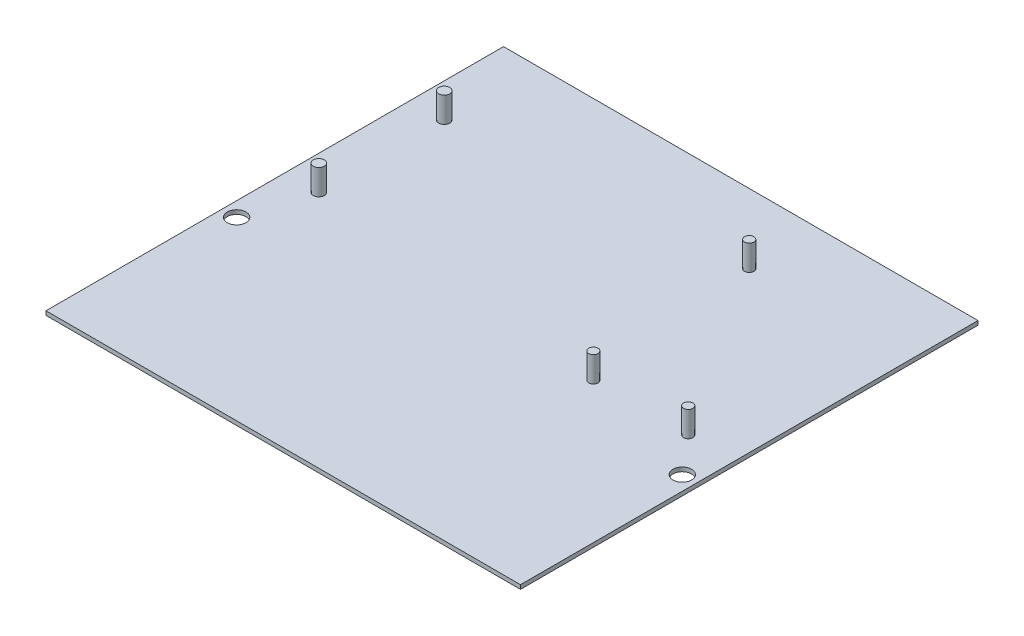
ISO-10303-21;
HEADER;
FILE_DESCRIPTION(('STEP AP214'),'2;1');
FILE_NAME('part.step','',(''),(''),'','','');
FILE_SCHEMA(('AUTOMOTIVE_DESIGN { 1 0 10303 214 1 1 1 1 }'));
ENDSEC;
DATA;
#1=APPLICATION_CONTEXT('core data for automotive mechanical design processes');
#2=APPLICATION_PROTOCOL_DEFINITION('international standard','automotive_design',2000,#1);
#3=PRODUCT_CONTEXT('',#1,'mechanical');
#4=PRODUCT('Part','Part','',(#3));
#5=PRODUCT_RELATED_PRODUCT_CATEGORY('part','',(#4));
#6=PRODUCT_DEFINITION_FORMATION('','',#4);
#7=PRODUCT_DEFINITION_CONTEXT('part definition',#1,'design');
#8=PRODUCT_DEFINITION('design','',#6,#7);
#9=PRODUCT_DEFINITION_SHAPE('','',#8);
#10=(LENGTH_UNIT() NAMED_UNIT(*) SI_UNIT(.MILLI.,.METRE.));
#11=(NAMED_UNIT(*) PLANE_ANGLE_UNIT() SI_UNIT($,.RADIAN.));
#12=(NAMED_UNIT(*) SI_UNIT($,.STERADIAN.) SOLID_ANGLE_UNIT());
#13=UNCERTAINTY_MEASURE_WITH_UNIT(LENGTH_MEASURE(1.E-05),#10,'distance_accuracy_value','');
#14=(GEOMETRIC_REPRESENTATION_CONTEXT(3) GLOBAL_UNCERTAINTY_ASSIGNED_CONTEXT((#13)) GLOBAL_UNIT_ASSIGNED_CONTEXT((#10,
#11,#12)) REPRESENTATION_CONTEXT('',''));
#15=CARTESIAN_POINT('',(0.,0.,0.));
#16=DIRECTION('',(0.,0.,1.));
#17=DIRECTION('',(1.,0.,0.));
#18=AXIS2_PLACEMENT_3D('',#15,#16,#17);
#19=CARTESIAN_POINT('',(0.,1.2,0.));
#20=DIRECTION('',(0.,1.,0.));
#21=DIRECTION('',(0.,0.,1.));
#22=AXIS2_PLACEMENT_3D('',#19,#20,#21);
#23=PLANE('',#22);
#24=CARTESIAN_POINT('',(28.5,1.2,4.49999999999998));
#25=DIRECTION('',(0.,1.,0.));
#26=DIRECTION('',(0.,0.,1.));
#27=AXIS2_PLACEMENT_3D('',#24,#25,#26);
#28=CIRCLE('',#27,1.375);
#29=CARTESIAN_POINT('',(28.5,1.2,5.87499999999998));
#30=VERTEX_POINT('',#29);
#31=EDGE_CURVE('E142',#30,#30,#28,.T.);
#32=ORIENTED_EDGE('',*,*,#31,.F.);
#33=EDGE_LOOP('',(#32));
#34=FACE_BOUND('',#33,.T.);
#35=CARTESIAN_POINT('',(-60.,1.2,-3.00000000000004));
#36=DIRECTION('',(0.,1.,0.));
#37=DIRECTION('',(0.,0.,1.));
#38=AXIS2_PLACEMENT_3D('',#35,#36,#37);
#39=CIRCLE('',#38,1.625);
#40=CARTESIAN_POINT('',(-60.,1.2,-1.37500000000003));
#41=VERTEX_POINT('',#40);
#42=EDGE_CURVE('E130',#41,#41,#39,.T.);
#43=ORIENTED_EDGE('',*,*,#42,.F.);
#44=EDGE_LOOP('',(#43));
#45=FACE_BOUND('',#44,.T.);
#46=CARTESIAN_POINT('',(-65.75,1.2,15.5));
#47=DIRECTION('',(0.,-1.,0.));
#48=DIRECTION('',(0.,0.,1.));
#49=AXIS2_PLACEMENT_3D('',#46,#47,#48);
#50=CIRCLE('',#49,2.75000000000001);
#51=CARTESIAN_POINT('',(-65.75,1.2,18.25));
#52=VERTEX_POINT('',#51);
#53=EDGE_CURVE('E117',#52,#52,#50,.T.);
#54=ORIENTED_EDGE('',*,*,#53,.T.);
#55=EDGE_LOOP('',(#54));
#56=FACE_BOUND('',#55,.T.);
#57=CARTESIAN_POINT('',(65.75,1.2,15.5));
#58=DIRECTION('',(0.,1.,0.));
#59=DIRECTION('',(0.,0.,1.));
#60=AXIS2_PLACEMENT_3D('',#57,#58,#59);
#61=CIRCLE('',#60,2.75000000000001);
#62=CARTESIAN_POINT('',(65.75,1.2,18.25));
#63=VERTEX_POINT('',#62);
#64=EDGE_CURVE('E114',#63,#63,#61,.T.);
#65=ORIENTED_EDGE('',*,*,#64,.F.);
#66=EDGE_LOOP('',(#65));
#67=FACE_BOUND('',#66,.T.);
#68=DIRECTION('',(0.,0.,-1.));
#69=VECTOR('',#68,1.);
#70=CARTESIAN_POINT('',(70.,1.2,-67.5));
#71=LINE('',#70,#69);
#72=CARTESIAN_POINT('',(70.,1.2,67.5));
#73=VERTEX_POINT('',#72);
#74=CARTESIAN_POINT('',(70.,1.2,-67.5));
#75=VERTEX_POINT('',#74);
#76=EDGE_CURVE('E85',#73,#75,#71,.T.);
#77=ORIENTED_EDGE('',*,*,#76,.T.);
#78=DIRECTION('',(-1.,0.,0.));
#79=VECTOR('',#78,1.);
#80=CARTESIAN_POINT('',(-70.,1.2,-67.5));
#81=LINE('',#80,#79);
#82=CARTESIAN_POINT('',(-70.,1.2,-67.5));
#83=VERTEX_POINT('',#82);
#84=EDGE_CURVE('E80',#75,#83,#81,.T.);
#85=ORIENTED_EDGE('',*,*,#84,.T.);
#86=DIRECTION('',(0.,0.,1.));
#87=VECTOR('',#86,1.);
#88=CARTESIAN_POINT('',(-70.,1.2,-67.5));
#89=LINE('',#88,#87);
#90=CARTESIAN_POINT('',(-70.,1.2,67.5));
#91=VERTEX_POINT('',#90);
#92=EDGE_CURVE('E83',#83,#91,#89,.T.);
#93=ORIENTED_EDGE('',*,*,#92,.T.);
#94=DIRECTION('',(1.,0.,0.));
#95=VECTOR('',#94,1.);
#96=CARTESIAN_POINT('',(-70.,1.2,67.5));
#97=LINE('',#96,#95);
#98=EDGE_CURVE('E50',#91,#73,#97,.T.);
#99=ORIENTED_EDGE('',*,*,#98,.T.);
#100=EDGE_LOOP('',(#77,#85,#93,#99));
#101=FACE_BOUND('',#100,.T.);
#102=CARTESIAN_POINT('',(-60.,1.2,-40.));
#103=DIRECTION('',(0.,1.,0.));
#104=DIRECTION('',(0.,0.,1.));
#105=AXIS2_PLACEMENT_3D('',#102,#103,#104);
#106=CIRCLE('',#105,1.625);
#107=CARTESIAN_POINT('',(-60.,1.2,-38.375));
#108=VERTEX_POINT('',#107);
#109=EDGE_CURVE('E124',#108,#108,#106,.T.);
#110=ORIENTED_EDGE('',*,*,#109,.F.);
#111=EDGE_LOOP('',(#110));
#112=FACE_BOUND('',#111,.T.);
#113=CARTESIAN_POINT('',(56.5,1.2,4.49999999999998));
#114=DIRECTION('',(0.,1.,0.));
#115=DIRECTION('',(0.,0.,1.));
#116=AXIS2_PLACEMENT_3D('',#113,#114,#115);
#117=CIRCLE('',#116,1.375);
#118=CARTESIAN_POINT('',(56.5,1.2,5.87499999999998));
#119=VERTEX_POINT('',#118);
#120=EDGE_CURVE('E136',#119,#119,#117,.T.);
#121=ORIENTED_EDGE('',*,*,#120,.F.);
#122=EDGE_LOOP('',(#121));
#123=FACE_BOUND('',#122,.T.);
#124=CARTESIAN_POINT('',(23.,1.2,-47.));
#125=DIRECTION('',(0.,1.,0.));
#126=DIRECTION('',(0.,0.,1.));
#127=AXIS2_PLACEMENT_3D('',#124,#125,#126);
#128=CIRCLE('',#127,1.375);
#129=CARTESIAN_POINT('',(23.,1.2,-45.625));
#130=VERTEX_POINT('',#129);
#131=EDGE_CURVE('E148',#130,#130,#128,.T.);
#132=ORIENTED_EDGE('',*,*,#131,.F.);
#133=EDGE_LOOP('',(#132));
#134=FACE_BOUND('',#133,.T.);
#135=ADVANCED_FACE('F33',(#34,#45,#56,#67,#101,#112,#123,#134),#23,.T.);
#136=CARTESIAN_POINT('',(0.,0.,0.));
#137=DIRECTION('',(0.,1.,0.));
#138=DIRECTION('',(0.,0.,1.));
#139=AXIS2_PLACEMENT_3D('',#136,#137,#138);
#140=PLANE('',#139);
#141=DIRECTION('',(0.,0.,-1.));
#142=VECTOR('',#141,1.);
#143=CARTESIAN_POINT('',(70.,0.,-67.5));
#144=LINE('',#143,#142);
#145=CARTESIAN_POINT('',(70.,0.,67.5));
#146=VERTEX_POINT('',#145);
#147=CARTESIAN_POINT('',(70.,0.,-67.5));
#148=VERTEX_POINT('',#147);
#149=EDGE_CURVE('E97',#146,#148,#144,.T.);
#150=ORIENTED_EDGE('',*,*,#149,.F.);
#151=DIRECTION('',(1.,0.,0.));
#152=VECTOR('',#151,1.);
#153=CARTESIAN_POINT('',(-70.,0.,67.5));
#154=LINE('',#153,#152);
#155=CARTESIAN_POINT('',(-70.,0.,67.5));
#156=VERTEX_POINT('',#155);
#157=EDGE_CURVE('E73',#156,#146,#154,.T.);
#158=ORIENTED_EDGE('',*,*,#157,.F.);
#159=DIRECTION('',(0.,0.,1.));
#160=VECTOR('',#159,1.);
#161=CARTESIAN_POINT('',(-70.,0.,-67.5));
#162=LINE('',#161,#160);
#163=CARTESIAN_POINT('',(-70.,0.,-67.5));
#164=VERTEX_POINT('',#163);
#165=EDGE_CURVE('E67',#164,#156,#162,.T.);
#166=ORIENTED_EDGE('',*,*,#165,.F.);
#167=DIRECTION('',(-1.,0.,0.));
#168=VECTOR('',#167,1.);
#169=CARTESIAN_POINT('',(-70.,0.,-67.5));
#170=LINE('',#169,#168);
#171=EDGE_CURVE('E89',#148,#164,#170,.T.);
#172=ORIENTED_EDGE('',*,*,#171,.F.);
#173=EDGE_LOOP('',(#150,#158,#166,#172));
#174=FACE_BOUND('',#173,.T.);
#175=CARTESIAN_POINT('',(65.75,0.,15.5));
#176=DIRECTION('',(0.,1.,0.));
#177=DIRECTION('',(0.,0.,1.));
#178=AXIS2_PLACEMENT_3D('',#175,#176,#177);
#179=CIRCLE('',#178,2.75000000000001);
#180=CARTESIAN_POINT('',(65.75,0.,18.25));
#181=VERTEX_POINT('',#180);
#182=EDGE_CURVE('E100',#181,#181,#179,.F.);
#183=ORIENTED_EDGE('',*,*,#182,.F.);
#184=EDGE_LOOP('',(#183));
#185=FACE_BOUND('',#184,.T.);
#186=CARTESIAN_POINT('',(-65.75,0.,15.5));
#187=DIRECTION('',(0.,1.,0.));
#188=DIRECTION('',(0.,0.,1.));
#189=AXIS2_PLACEMENT_3D('',#186,#187,#188);
#190=CIRCLE('',#189,2.75000000000001);
#191=CARTESIAN_POINT('',(-65.75,0.,18.25));
#192=VERTEX_POINT('',#191);
#193=EDGE_CURVE('E118',#192,#192,#190,.T.);
#194=ORIENTED_EDGE('',*,*,#193,.T.);
#195=EDGE_LOOP('',(#194));
#196=FACE_BOUND('',#195,.T.);
#197=ADVANCED_FACE('F108',(#174,#185,#196),#140,.F.);
#198=CARTESIAN_POINT('',(70.,1.2,-67.5));
#199=DIRECTION('',(-1.,0.,0.));
#200=DIRECTION('',(0.,0.,1.));
#201=AXIS2_PLACEMENT_3D('',#198,#199,#200);
#202=PLANE('',#201);
#203=ORIENTED_EDGE('',*,*,#149,.T.);
#204=DIRECTION('',(0.,-1.,0.));
#205=VECTOR('',#204,1.);
#206=CARTESIAN_POINT('',(70.,1.2,-67.5));
#207=LINE('',#206,#205);
#208=EDGE_CURVE('E11',#75,#148,#207,.T.);
#209=ORIENTED_EDGE('',*,*,#208,.F.);
#210=ORIENTED_EDGE('',*,*,#76,.F.);
#211=DIRECTION('',(0.,-1.,0.));
#212=VECTOR('',#211,1.);
#213=CARTESIAN_POINT('',(70.,1.2,67.5));
#214=LINE('',#213,#212);
#215=EDGE_CURVE('E93',#73,#146,#214,.T.);
#216=ORIENTED_EDGE('',*,*,#215,.T.);
#217=EDGE_LOOP('',(#203,#209,#210,#216));
#218=FACE_BOUND('',#217,.T.);
#219=ADVANCED_FACE('F35',(#218),#202,.F.);
#220=CARTESIAN_POINT('',(-70.,1.2,-67.5));
#221=DIRECTION('',(0.,0.,1.));
#222=DIRECTION('',(1.,0.,0.));
#223=AXIS2_PLACEMENT_3D('',#220,#221,#222);
#224=PLANE('',#223);
#225=ORIENTED_EDGE('',*,*,#171,.T.);
#226=DIRECTION('',(0.,-1.,0.));
#227=VECTOR('',#226,1.);
#228=CARTESIAN_POINT('',(-70.,1.2,-67.5));
#229=LINE('',#228,#227);
#230=EDGE_CURVE('E42',#83,#164,#229,.T.);
#231=ORIENTED_EDGE('',*,*,#230,.F.);
#232=ORIENTED_EDGE('',*,*,#84,.F.);
#233=ORIENTED_EDGE('',*,*,#208,.T.);
#234=EDGE_LOOP('',(#225,#231,#232,#233));
#235=FACE_BOUND('',#234,.T.);
#236=ADVANCED_FACE('F88',(#235),#224,.F.);
#237=CARTESIAN_POINT('',(-70.,1.2,-67.5));
#238=DIRECTION('',(1.,0.,0.));
#239=DIRECTION('',(0.,0.,-1.));
#240=AXIS2_PLACEMENT_3D('',#237,#238,#239);
#241=PLANE('',#240);
#242=ORIENTED_EDGE('',*,*,#165,.T.);
#243=DIRECTION('',(0.,-1.,0.));
#244=VECTOR('',#243,1.);
#245=CARTESIAN_POINT('',(-70.,1.2,67.5));
#246=LINE('',#245,#244);
#247=EDGE_CURVE('E90',#91,#156,#246,.T.);
#248=ORIENTED_EDGE('',*,*,#247,.F.);
#249=ORIENTED_EDGE('',*,*,#92,.F.);
#250=ORIENTED_EDGE('',*,*,#230,.T.);
#251=EDGE_LOOP('',(#242,#248,#249,#250));
#252=FACE_BOUND('',#251,.T.);
#253=ADVANCED_FACE('F91',(#252),#241,.F.);
#254=CARTESIAN_POINT('',(-70.,1.2,67.5));
#255=DIRECTION('',(0.,0.,-1.));
#256=DIRECTION('',(-1.,0.,0.));
#257=AXIS2_PLACEMENT_3D('',#254,#255,#256);
#258=PLANE('',#257);
#259=ORIENTED_EDGE('',*,*,#157,.T.);
#260=ORIENTED_EDGE('',*,*,#215,.F.);
#261=ORIENTED_EDGE('',*,*,#98,.F.);
#262=ORIENTED_EDGE('',*,*,#247,.T.);
#263=EDGE_LOOP('',(#259,#260,#261,#262));
#264=FACE_BOUND('',#263,.T.);
#265=ADVANCED_FACE('F105',(#264),#258,.F.);
#266=CARTESIAN_POINT('',(65.75,-0.000999999999999916,15.5));
#267=DIRECTION('',(0.,1.,0.));
#268=DIRECTION('',(0.,0.,1.));
#269=AXIS2_PLACEMENT_3D('',#266,#267,#268);
#270=CYLINDRICAL_SURFACE('',#269,2.75000000000001);
#271=ORIENTED_EDGE('',*,*,#64,.T.);
#272=EDGE_LOOP('',(#271));
#273=FACE_BOUND('',#272,.T.);
#274=ORIENTED_EDGE('',*,*,#182,.T.);
#275=EDGE_LOOP('',(#274));
#276=FACE_BOUND('',#275,.T.);
#277=ADVANCED_FACE('F175',(#273,#276),#270,.F.);
#278=CARTESIAN_POINT('',(-65.75,-0.000999999999999916,15.5));
#279=DIRECTION('',(0.,1.,0.));
#280=DIRECTION('',(0.,0.,1.));
#281=AXIS2_PLACEMENT_3D('',#278,#279,#280);
#282=CYLINDRICAL_SURFACE('',#281,2.75000000000001);
#283=ORIENTED_EDGE('',*,*,#53,.F.);
#284=EDGE_LOOP('',(#283));
#285=FACE_BOUND('',#284,.T.);
#286=ORIENTED_EDGE('',*,*,#193,.F.);
#287=EDGE_LOOP('',(#286));
#288=FACE_BOUND('',#287,.T.);
#289=ADVANCED_FACE('F212',(#285,#288),#282,.F.);
#290=CARTESIAN_POINT('',(-60.,8.7,-40.));
#291=DIRECTION('',(0.,-1.,0.));
#292=DIRECTION('',(0.,0.,-1.));
#293=AXIS2_PLACEMENT_3D('',#290,#291,#292);
#294=CYLINDRICAL_SURFACE('',#293,1.625);
#295=CARTESIAN_POINT('',(-60.,8.7,-40.));
#296=DIRECTION('',(0.,1.,0.));
#297=DIRECTION('',(0.,0.,1.));
#298=AXIS2_PLACEMENT_3D('',#295,#296,#297);
#299=CIRCLE('',#298,1.625);
#300=CARTESIAN_POINT('',(-60.,8.7,-38.375));
#301=VERTEX_POINT('',#300);
#302=EDGE_CURVE('E121',#301,#301,#299,.T.);
#303=ORIENTED_EDGE('',*,*,#302,.F.);
#304=EDGE_LOOP('',(#303));
#305=FACE_BOUND('',#304,.T.);
#306=ORIENTED_EDGE('',*,*,#109,.T.);
#307=EDGE_LOOP('',(#306));
#308=FACE_BOUND('',#307,.T.);
#309=ADVANCED_FACE('F226',(#305,#308),#294,.T.);
#310=CARTESIAN_POINT('',(-60.,8.7,-40.));
#311=DIRECTION('',(0.,1.,0.));
#312=DIRECTION('',(0.,0.,1.));
#313=AXIS2_PLACEMENT_3D('',#310,#311,#312);
#314=PLANE('',#313);
#315=ORIENTED_EDGE('',*,*,#302,.T.);
#316=EDGE_LOOP('',(#315));
#317=FACE_BOUND('',#316,.T.);
#318=ADVANCED_FACE('F235',(#317),#314,.T.);
#319=CARTESIAN_POINT('',(-60.,8.7,-3.00000000000004));
#320=DIRECTION('',(0.,-1.,0.));
#321=DIRECTION('',(0.,0.,-1.));
#322=AXIS2_PLACEMENT_3D('',#319,#320,#321);
#323=CYLINDRICAL_SURFACE('',#322,1.625);
#324=CARTESIAN_POINT('',(-60.,8.7,-3.00000000000004));
#325=DIRECTION('',(0.,1.,0.));
#326=DIRECTION('',(0.,0.,1.));
#327=AXIS2_PLACEMENT_3D('',#324,#325,#326);
#328=CIRCLE('',#327,1.625);
#329=CARTESIAN_POINT('',(-60.,8.7,-1.37500000000003));
#330=VERTEX_POINT('',#329);
#331=EDGE_CURVE('E127',#330,#330,#328,.T.);
#332=ORIENTED_EDGE('',*,*,#331,.F.);
#333=EDGE_LOOP('',(#332));
#334=FACE_BOUND('',#333,.T.);
#335=ORIENTED_EDGE('',*,*,#42,.T.);
#336=EDGE_LOOP('',(#335));
#337=FACE_BOUND('',#336,.T.);
#338=ADVANCED_FACE('F245',(#334,#337),#323,.T.);
#339=CARTESIAN_POINT('',(-60.,8.7,-3.00000000000004));
#340=DIRECTION('',(0.,1.,0.));
#341=DIRECTION('',(0.,0.,1.));
#342=AXIS2_PLACEMENT_3D('',#339,#340,#341);
#343=PLANE('',#342);
#344=ORIENTED_EDGE('',*,*,#331,.T.);
#345=EDGE_LOOP('',(#344));
#346=FACE_BOUND('',#345,.T.);
#347=ADVANCED_FACE('F254',(#346),#343,.T.);
#348=CARTESIAN_POINT('',(56.5,8.7,4.49999999999998));
#349=DIRECTION('',(0.,-1.,0.));
#350=DIRECTION('',(0.,0.,-1.));
#351=AXIS2_PLACEMENT_3D('',#348,#349,#350);
#352=CYLINDRICAL_SURFACE('',#351,1.375);
#353=CARTESIAN_POINT('',(56.5,8.7,4.49999999999998));
#354=DIRECTION('',(0.,1.,0.));
#355=DIRECTION('',(0.,0.,1.));
#356=AXIS2_PLACEMENT_3D('',#353,#354,#355);
#357=CIRCLE('',#356,1.375);
#358=CARTESIAN_POINT('',(56.5,8.7,5.87499999999998));
#359=VERTEX_POINT('',#358);
#360=EDGE_CURVE('E133',#359,#359,#357,.T.);
#361=ORIENTED_EDGE('',*,*,#360,.F.);
#362=EDGE_LOOP('',(#361));
#363=FACE_BOUND('',#362,.T.);
#364=ORIENTED_EDGE('',*,*,#120,.T.);
#365=EDGE_LOOP('',(#364));
#366=FACE_BOUND('',#365,.T.);
#367=ADVANCED_FACE('F263',(#363,#366),#352,.T.);
#368=CARTESIAN_POINT('',(56.5,8.7,4.49999999999998));
#369=DIRECTION('',(0.,1.,0.));
#370=DIRECTION('',(0.,0.,1.));
#371=AXIS2_PLACEMENT_3D('',#368,#369,#370);
#372=PLANE('',#371);
#373=ORIENTED_EDGE('',*,*,#360,.T.);
#374=EDGE_LOOP('',(#373));
#375=FACE_BOUND('',#374,.T.);
#376=ADVANCED_FACE('F277',(#375),#372,.T.);
#377=CARTESIAN_POINT('',(28.5,8.7,4.49999999999998));
#378=DIRECTION('',(0.,-1.,0.));
#379=DIRECTION('',(0.,0.,-1.));
#380=AXIS2_PLACEMENT_3D('',#377,#378,#379);
#381=CYLINDRICAL_SURFACE('',#380,1.375);
#382=CARTESIAN_POINT('',(28.5,8.7,4.49999999999998));
#383=DIRECTION('',(0.,1.,0.));
#384=DIRECTION('',(0.,0.,1.));
#385=AXIS2_PLACEMENT_3D('',#382,#383,#384);
#386=CIRCLE('',#385,1.375);
#387=CARTESIAN_POINT('',(28.5,8.7,5.87499999999998));
#388=VERTEX_POINT('',#387);
#389=EDGE_CURVE('E139',#388,#388,#386,.T.);
#390=ORIENTED_EDGE('',*,*,#389,.F.);
#391=EDGE_LOOP('',(#390));
#392=FACE_BOUND('',#391,.T.);
#393=ORIENTED_EDGE('',*,*,#31,.T.);
#394=EDGE_LOOP('',(#393));
#395=FACE_BOUND('',#394,.T.);
#396=ADVANCED_FACE('F284',(#392,#395),#381,.T.);
#397=CARTESIAN_POINT('',(28.5,8.7,4.49999999999998));
#398=DIRECTION('',(0.,1.,0.));
#399=DIRECTION('',(0.,0.,1.));
#400=AXIS2_PLACEMENT_3D('',#397,#398,#399);
#401=PLANE('',#400);
#402=ORIENTED_EDGE('',*,*,#389,.T.);
#403=EDGE_LOOP('',(#402));
#404=FACE_BOUND('',#403,.T.);
#405=ADVANCED_FACE('F159',(#404),#401,.T.);
#406=CARTESIAN_POINT('',(23.,8.7,-47.));
#407=DIRECTION('',(0.,-1.,0.));
#408=DIRECTION('',(0.,0.,-1.));
#409=AXIS2_PLACEMENT_3D('',#406,#407,#408);
#410=CYLINDRICAL_SURFACE('',#409,1.375);
#411=CARTESIAN_POINT('',(23.,8.7,-47.));
#412=DIRECTION('',(0.,1.,0.));
#413=DIRECTION('',(0.,0.,1.));
#414=AXIS2_PLACEMENT_3D('',#411,#412,#413);
#415=CIRCLE('',#414,1.375);
#416=CARTESIAN_POINT('',(23.,8.7,-45.625));
#417=VERTEX_POINT('',#416);
#418=EDGE_CURVE('E145',#417,#417,#415,.T.);
#419=ORIENTED_EDGE('',*,*,#418,.F.);
#420=EDGE_LOOP('',(#419));
#421=FACE_BOUND('',#420,.T.);
#422=ORIENTED_EDGE('',*,*,#131,.T.);
#423=EDGE_LOOP('',(#422));
#424=FACE_BOUND('',#423,.T.);
#425=ADVANCED_FACE('F156',(#421,#424),#410,.T.);
#426=CARTESIAN_POINT('',(23.,8.7,-47.));
#427=DIRECTION('',(0.,1.,0.));
#428=DIRECTION('',(0.,0.,1.));
#429=AXIS2_PLACEMENT_3D('',#426,#427,#428);
#430=PLANE('',#429);
#431=ORIENTED_EDGE('',*,*,#418,.T.);
#432=EDGE_LOOP('',(#431));
#433=FACE_BOUND('',#432,.T.);
#434=ADVANCED_FACE('F154',(#433),#430,.T.);
#435=CLOSED_SHELL('',(#135,#197,#219,#236,#253,#265,#277,#289,#309,#318,#338,#347,#367,#376,
#396,#405,#425,#434));
#436=MANIFOLD_SOLID_BREP('B2',#435);
#437=ADVANCED_BREP_SHAPE_REPRESENTATION('',(#18,#436),#14);
#438=SHAPE_DEFINITION_REPRESENTATION(#9,#437);
ENDSEC;
END-ISO-10303-21;
